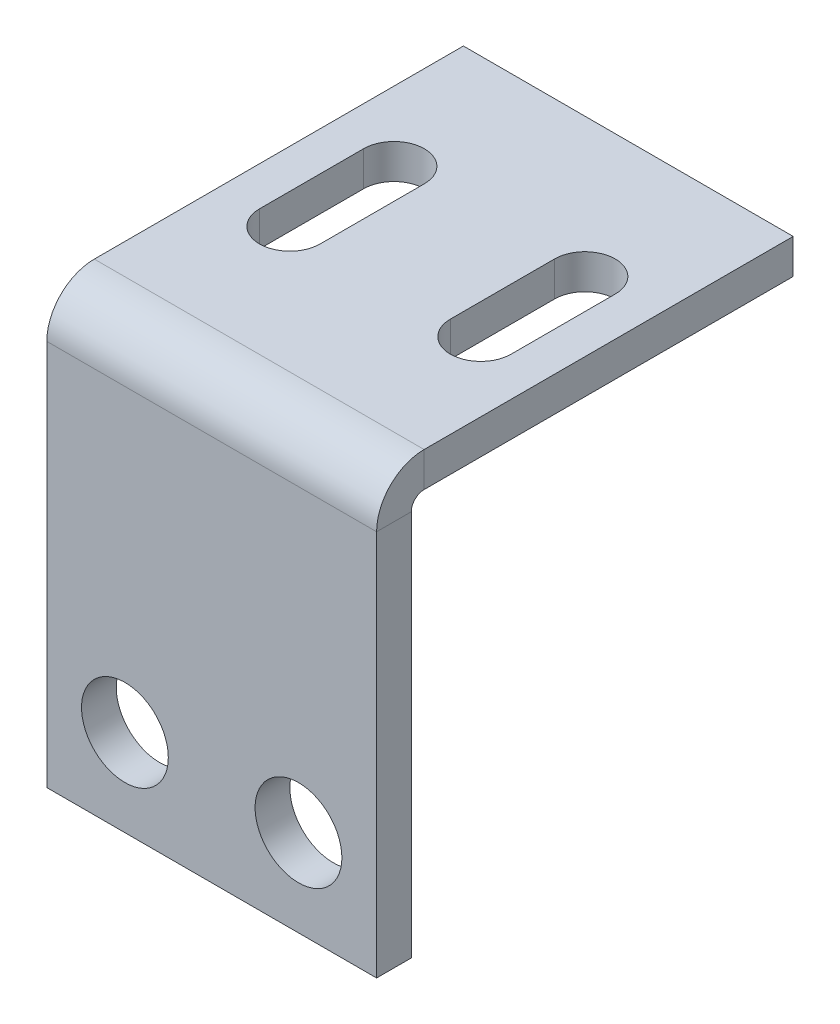
ISO-10303-21;
HEADER;
FILE_DESCRIPTION(('STEP AP214'),'2;1');
FILE_NAME('part.step','',(''),(''),'','','');
FILE_SCHEMA(('AUTOMOTIVE_DESIGN { 1 0 10303 214 1 1 1 1 }'));
ENDSEC;
DATA;
#1=APPLICATION_CONTEXT('core data for automotive mechanical design processes');
#2=APPLICATION_PROTOCOL_DEFINITION('international standard','automotive_design',2000,#1);
#3=PRODUCT_CONTEXT('',#1,'mechanical');
#4=PRODUCT('Part','Part','',(#3));
#5=PRODUCT_RELATED_PRODUCT_CATEGORY('part','',(#4));
#6=PRODUCT_DEFINITION_FORMATION('','',#4);
#7=PRODUCT_DEFINITION_CONTEXT('part definition',#1,'design');
#8=PRODUCT_DEFINITION('design','',#6,#7);
#9=PRODUCT_DEFINITION_SHAPE('','',#8);
#10=(LENGTH_UNIT() NAMED_UNIT(*) SI_UNIT(.MILLI.,.METRE.));
#11=(NAMED_UNIT(*) PLANE_ANGLE_UNIT() SI_UNIT($,.RADIAN.));
#12=(NAMED_UNIT(*) SI_UNIT($,.STERADIAN.) SOLID_ANGLE_UNIT());
#13=UNCERTAINTY_MEASURE_WITH_UNIT(LENGTH_MEASURE(1.E-05),#10,'distance_accuracy_value','');
#14=(GEOMETRIC_REPRESENTATION_CONTEXT(3) GLOBAL_UNCERTAINTY_ASSIGNED_CONTEXT((#13)) GLOBAL_UNIT_ASSIGNED_CONTEXT((#10,
#11,#12)) REPRESENTATION_CONTEXT('',''));
#15=CARTESIAN_POINT('',(0.,0.,0.));
#16=DIRECTION('',(0.,0.,1.));
#17=DIRECTION('',(1.,0.,0.));
#18=AXIS2_PLACEMENT_3D('',#15,#16,#17);
#19=CARTESIAN_POINT('',(9.49999999999998,12.5,-2.));
#20=DIRECTION('',(1.,0.,0.));
#21=DIRECTION('',(0.,1.,0.));
#22=AXIS2_PLACEMENT_3D('',#19,#20,#21);
#23=PLANE('',#22);
#24=DIRECTION('',(0.,1.,0.));
#25=VECTOR('',#24,1.);
#26=CARTESIAN_POINT('',(9.49999999999998,12.5,-2.));
#27=LINE('',#26,#25);
#28=CARTESIAN_POINT('',(9.49999999999998,-12.5,-2.));
#29=VERTEX_POINT('',#28);
#30=CARTESIAN_POINT('',(9.49999999999998,9.76339999999996,-2.));
#31=VERTEX_POINT('',#30);
#32=EDGE_CURVE('E279',#29,#31,#27,.T.);
#33=ORIENTED_EDGE('',*,*,#32,.T.);
#34=DIRECTION('',(0.,0.,1.));
#35=VECTOR('',#34,1.);
#36=CARTESIAN_POINT('',(9.49999999999998,9.76339999999996,-2.));
#37=LINE('',#36,#35);
#38=CARTESIAN_POINT('',(9.49999999999998,9.76339999999996,0.));
#39=VERTEX_POINT('',#38);
#40=EDGE_CURVE('E251',#31,#39,#37,.T.);
#41=ORIENTED_EDGE('',*,*,#40,.T.);
#42=DIRECTION('',(0.,1.,0.));
#43=VECTOR('',#42,1.);
#44=CARTESIAN_POINT('',(9.49999999999998,12.5,0.));
#45=LINE('',#44,#43);
#46=CARTESIAN_POINT('',(9.49999999999998,-12.5,0.));
#47=VERTEX_POINT('',#46);
#48=EDGE_CURVE('E276',#47,#39,#45,.T.);
#49=ORIENTED_EDGE('',*,*,#48,.F.);
#50=DIRECTION('',(0.,0.,1.));
#51=VECTOR('',#50,1.);
#52=CARTESIAN_POINT('',(9.49999999999998,-12.5,-2.));
#53=LINE('',#52,#51);
#54=EDGE_CURVE('E295',#29,#47,#53,.T.);
#55=ORIENTED_EDGE('',*,*,#54,.F.);
#56=EDGE_LOOP('',(#33,#41,#49,#55));
#57=FACE_BOUND('',#56,.T.);
#58=ADVANCED_FACE('F54',(#57),#23,.T.);
#59=CARTESIAN_POINT('',(9.49999999999998,-12.5,-2.));
#60=DIRECTION('',(0.,0.,1.));
#61=DIRECTION('',(1.,0.,0.));
#62=AXIS2_PLACEMENT_3D('',#59,#60,#61);
#63=PLANE('',#62);
#64=CARTESIAN_POINT('',(-5.00000000000002,-7.50000000000004,-2.));
#65=DIRECTION('',(0.,0.,1.));
#66=DIRECTION('',(1.,0.,0.));
#67=AXIS2_PLACEMENT_3D('',#64,#65,#66);
#68=CIRCLE('',#67,2.5);
#69=CARTESIAN_POINT('',(-2.50000000000002,-7.50000000000004,-2.));
#70=VERTEX_POINT('',#69);
#71=EDGE_CURVE('E273',#70,#70,#68,.T.);
#72=ORIENTED_EDGE('',*,*,#71,.T.);
#73=EDGE_LOOP('',(#72));
#74=FACE_BOUND('',#73,.T.);
#75=CARTESIAN_POINT('',(4.99999999999998,-7.50000000000004,-2.));
#76=DIRECTION('',(0.,0.,1.));
#77=DIRECTION('',(1.,0.,0.));
#78=AXIS2_PLACEMENT_3D('',#75,#76,#77);
#79=CIRCLE('',#78,2.5);
#80=CARTESIAN_POINT('',(7.49999999999998,-7.50000000000004,-2.));
#81=VERTEX_POINT('',#80);
#82=EDGE_CURVE('E267',#81,#81,#79,.T.);
#83=ORIENTED_EDGE('',*,*,#82,.T.);
#84=EDGE_LOOP('',(#83));
#85=FACE_BOUND('',#84,.T.);
#86=DIRECTION('',(1.,0.,0.));
#87=VECTOR('',#86,1.);
#88=CARTESIAN_POINT('',(9.49999999999998,9.76339999999996,-2.));
#89=LINE('',#88,#87);
#90=CARTESIAN_POINT('',(-9.50000000000002,9.76339999999996,-2.));
#91=VERTEX_POINT('',#90);
#92=EDGE_CURVE('E257',#31,#91,#89,.F.);
#93=ORIENTED_EDGE('',*,*,#92,.F.);
#94=ORIENTED_EDGE('',*,*,#32,.F.);
#95=DIRECTION('',(1.,0.,0.));
#96=VECTOR('',#95,1.);
#97=CARTESIAN_POINT('',(-9.50000000000002,-12.5,-2.));
#98=LINE('',#97,#96);
#99=CARTESIAN_POINT('',(-9.50000000000002,-12.5,-2.));
#100=VERTEX_POINT('',#99);
#101=EDGE_CURVE('E285',#100,#29,#98,.T.);
#102=ORIENTED_EDGE('',*,*,#101,.F.);
#103=DIRECTION('',(0.,-1.,0.));
#104=VECTOR('',#103,1.);
#105=CARTESIAN_POINT('',(-9.50000000000002,12.5,-2.));
#106=LINE('',#105,#104);
#107=EDGE_CURVE('E282',#91,#100,#106,.T.);
#108=ORIENTED_EDGE('',*,*,#107,.F.);
#109=EDGE_LOOP('',(#93,#94,#102,#108));
#110=FACE_BOUND('',#109,.T.);
#111=ADVANCED_FACE('F333',(#74,#85,#110),#63,.F.);
#112=CARTESIAN_POINT('',(9.49999999999998,-12.5,0.));
#113=DIRECTION('',(0.,0.,1.));
#114=DIRECTION('',(1.,0.,0.));
#115=AXIS2_PLACEMENT_3D('',#112,#113,#114);
#116=PLANE('',#115);
#117=CARTESIAN_POINT('',(-5.00000000000002,-7.50000000000004,0.));
#118=DIRECTION('',(0.,0.,1.));
#119=DIRECTION('',(1.,0.,0.));
#120=AXIS2_PLACEMENT_3D('',#117,#118,#119);
#121=CIRCLE('',#120,2.5);
#122=CARTESIAN_POINT('',(-2.50000000000002,-7.50000000000004,0.));
#123=VERTEX_POINT('',#122);
#124=EDGE_CURVE('E270',#123,#123,#121,.T.);
#125=ORIENTED_EDGE('',*,*,#124,.F.);
#126=EDGE_LOOP('',(#125));
#127=FACE_BOUND('',#126,.T.);
#128=CARTESIAN_POINT('',(4.99999999999998,-7.50000000000004,0.));
#129=DIRECTION('',(0.,0.,1.));
#130=DIRECTION('',(1.,0.,0.));
#131=AXIS2_PLACEMENT_3D('',#128,#129,#130);
#132=CIRCLE('',#131,2.5);
#133=CARTESIAN_POINT('',(7.49999999999998,-7.50000000000004,0.));
#134=VERTEX_POINT('',#133);
#135=EDGE_CURVE('E264',#134,#134,#132,.T.);
#136=ORIENTED_EDGE('',*,*,#135,.F.);
#137=EDGE_LOOP('',(#136));
#138=FACE_BOUND('',#137,.T.);
#139=ORIENTED_EDGE('',*,*,#48,.T.);
#140=DIRECTION('',(1.,0.,0.));
#141=VECTOR('',#140,1.);
#142=CARTESIAN_POINT('',(9.49999999999998,9.76339999999996,0.));
#143=LINE('',#142,#141);
#144=CARTESIAN_POINT('',(-9.50000000000002,9.76339999999996,0.));
#145=VERTEX_POINT('',#144);
#146=EDGE_CURVE('E244',#39,#145,#143,.F.);
#147=ORIENTED_EDGE('',*,*,#146,.T.);
#148=DIRECTION('',(0.,-1.,0.));
#149=VECTOR('',#148,1.);
#150=CARTESIAN_POINT('',(-9.50000000000002,12.5,0.));
#151=LINE('',#150,#149);
#152=CARTESIAN_POINT('',(-9.50000000000002,-12.5,0.));
#153=VERTEX_POINT('',#152);
#154=EDGE_CURVE('E291',#145,#153,#151,.T.);
#155=ORIENTED_EDGE('',*,*,#154,.T.);
#156=DIRECTION('',(1.,0.,0.));
#157=VECTOR('',#156,1.);
#158=CARTESIAN_POINT('',(-9.50000000000002,-12.5,0.));
#159=LINE('',#158,#157);
#160=EDGE_CURVE('E283',#153,#47,#159,.T.);
#161=ORIENTED_EDGE('',*,*,#160,.T.);
#162=EDGE_LOOP('',(#139,#147,#155,#161));
#163=FACE_BOUND('',#162,.T.);
#164=ADVANCED_FACE('F338',(#127,#138,#163),#116,.T.);
#165=CARTESIAN_POINT('',(-9.50000000000002,-12.5,-2.));
#166=DIRECTION('',(0.,-1.,0.));
#167=DIRECTION('',(0.,0.,-1.));
#168=AXIS2_PLACEMENT_3D('',#165,#166,#167);
#169=PLANE('',#168);
#170=ORIENTED_EDGE('',*,*,#160,.F.);
#171=DIRECTION('',(0.,0.,1.));
#172=VECTOR('',#171,1.);
#173=CARTESIAN_POINT('',(-9.50000000000002,-12.5,-2.));
#174=LINE('',#173,#172);
#175=EDGE_CURVE('E288',#100,#153,#174,.T.);
#176=ORIENTED_EDGE('',*,*,#175,.F.);
#177=ORIENTED_EDGE('',*,*,#101,.T.);
#178=ORIENTED_EDGE('',*,*,#54,.T.);
#179=EDGE_LOOP('',(#170,#176,#177,#178));
#180=FACE_BOUND('',#179,.T.);
#181=ADVANCED_FACE('F350',(#180),#169,.T.);
#182=CARTESIAN_POINT('',(-9.50000000000002,12.5,-2.));
#183=DIRECTION('',(-1.,0.,0.));
#184=DIRECTION('',(0.,-1.,0.));
#185=AXIS2_PLACEMENT_3D('',#182,#183,#184);
#186=PLANE('',#185);
#187=DIRECTION('',(0.,0.,1.));
#188=VECTOR('',#187,1.);
#189=CARTESIAN_POINT('',(-9.50000000000002,9.76339999999996,-2.));
#190=LINE('',#189,#188);
#191=EDGE_CURVE('E261',#91,#145,#190,.T.);
#192=ORIENTED_EDGE('',*,*,#191,.F.);
#193=ORIENTED_EDGE('',*,*,#107,.T.);
#194=ORIENTED_EDGE('',*,*,#175,.T.);
#195=ORIENTED_EDGE('',*,*,#154,.F.);
#196=EDGE_LOOP('',(#192,#193,#194,#195));
#197=FACE_BOUND('',#196,.T.);
#198=ADVANCED_FACE('F354',(#197),#186,.T.);
#199=CARTESIAN_POINT('',(-5.00000000000002,-7.50000000000004,-2.));
#200=DIRECTION('',(0.,0.,1.));
#201=DIRECTION('',(1.,0.,0.));
#202=AXIS2_PLACEMENT_3D('',#199,#200,#201);
#203=CYLINDRICAL_SURFACE('',#202,2.5);
#204=ORIENTED_EDGE('',*,*,#71,.F.);
#205=EDGE_LOOP('',(#204));
#206=FACE_BOUND('',#205,.T.);
#207=ORIENTED_EDGE('',*,*,#124,.T.);
#208=EDGE_LOOP('',(#207));
#209=FACE_BOUND('',#208,.T.);
#210=ADVANCED_FACE('F411',(#206,#209),#203,.F.);
#211=CARTESIAN_POINT('',(4.99999999999998,-7.50000000000004,-2.));
#212=DIRECTION('',(0.,0.,1.));
#213=DIRECTION('',(1.,0.,0.));
#214=AXIS2_PLACEMENT_3D('',#211,#212,#213);
#215=CYLINDRICAL_SURFACE('',#214,2.5);
#216=ORIENTED_EDGE('',*,*,#82,.F.);
#217=EDGE_LOOP('',(#216));
#218=FACE_BOUND('',#217,.T.);
#219=ORIENTED_EDGE('',*,*,#135,.T.);
#220=EDGE_LOOP('',(#219));
#221=FACE_BOUND('',#220,.T.);
#222=ADVANCED_FACE('F406',(#218,#221),#215,.F.);
#223=CARTESIAN_POINT('',(-9.50000000000002,9.76339999999996,-2.7366));
#224=DIRECTION('',(-1.,0.,0.));
#225=DIRECTION('',(0.,0.,1.));
#226=AXIS2_PLACEMENT_3D('',#223,#224,#225);
#227=PLANE('',#226);
#228=DIRECTION('',(0.,-1.,0.));
#229=VECTOR('',#228,1.);
#230=CARTESIAN_POINT('',(-9.50000000000002,12.5,-2.73659999999999));
#231=LINE('',#230,#229);
#232=CARTESIAN_POINT('',(-9.50000000000002,10.5,-2.7366));
#233=VERTEX_POINT('',#232);
#234=CARTESIAN_POINT('',(-9.50000000000002,12.5,-2.73659999999999));
#235=VERTEX_POINT('',#234);
#236=EDGE_CURVE('E207',#233,#235,#231,.F.);
#237=ORIENTED_EDGE('',*,*,#236,.F.);
#238=CARTESIAN_POINT('',(-9.50000000000002,9.76339999999996,-2.7366));
#239=DIRECTION('',(1.,0.,0.));
#240=DIRECTION('',(0.,0.,-1.));
#241=AXIS2_PLACEMENT_3D('',#238,#239,#240);
#242=CIRCLE('',#241,0.7366);
#243=EDGE_CURVE('E254',#91,#233,#242,.F.);
#244=ORIENTED_EDGE('',*,*,#243,.F.);
#245=ORIENTED_EDGE('',*,*,#191,.T.);
#246=CARTESIAN_POINT('',(-9.50000000000002,9.76339999999996,-2.7366));
#247=DIRECTION('',(1.,0.,0.));
#248=DIRECTION('',(0.,0.,-1.));
#249=AXIS2_PLACEMENT_3D('',#246,#247,#248);
#250=CIRCLE('',#249,2.7366);
#251=EDGE_CURVE('E247',#145,#235,#250,.F.);
#252=ORIENTED_EDGE('',*,*,#251,.T.);
#253=EDGE_LOOP('',(#237,#244,#245,#252));
#254=FACE_BOUND('',#253,.T.);
#255=ADVANCED_FACE('F357',(#254),#227,.T.);
#256=CARTESIAN_POINT('',(9.49999999999998,9.76339999999996,-2.7366));
#257=DIRECTION('',(-1.,0.,0.));
#258=DIRECTION('',(0.,0.,1.));
#259=AXIS2_PLACEMENT_3D('',#256,#257,#258);
#260=PLANE('',#259);
#261=CARTESIAN_POINT('',(9.49999999999998,9.76339999999996,-2.7366));
#262=DIRECTION('',(1.,0.,0.));
#263=DIRECTION('',(0.,0.,-1.));
#264=AXIS2_PLACEMENT_3D('',#261,#262,#263);
#265=CIRCLE('',#264,0.7366);
#266=CARTESIAN_POINT('',(9.49999999999998,10.5,-2.7366));
#267=VERTEX_POINT('',#266);
#268=EDGE_CURVE('E217',#267,#31,#265,.T.);
#269=ORIENTED_EDGE('',*,*,#268,.F.);
#270=DIRECTION('',(0.,-1.,0.));
#271=VECTOR('',#270,1.);
#272=CARTESIAN_POINT('',(9.49999999999998,10.5,-2.7366));
#273=LINE('',#272,#271);
#274=CARTESIAN_POINT('',(9.49999999999998,12.5,-2.73659999999999));
#275=VERTEX_POINT('',#274);
#276=EDGE_CURVE('E237',#267,#275,#273,.F.);
#277=ORIENTED_EDGE('',*,*,#276,.T.);
#278=CARTESIAN_POINT('',(9.49999999999998,9.76339999999996,-2.7366));
#279=DIRECTION('',(1.,0.,0.));
#280=DIRECTION('',(0.,0.,-1.));
#281=AXIS2_PLACEMENT_3D('',#278,#279,#280);
#282=CIRCLE('',#281,2.7366);
#283=EDGE_CURVE('E248',#275,#39,#282,.T.);
#284=ORIENTED_EDGE('',*,*,#283,.T.);
#285=ORIENTED_EDGE('',*,*,#40,.F.);
#286=EDGE_LOOP('',(#269,#277,#284,#285));
#287=FACE_BOUND('',#286,.T.);
#288=ADVANCED_FACE('F363',(#287),#260,.F.);
#289=CARTESIAN_POINT('',(9.49999999999998,9.76339999999996,-2.7366));
#290=DIRECTION('',(1.,0.,0.));
#291=DIRECTION('',(0.,1.,0.));
#292=AXIS2_PLACEMENT_3D('',#289,#290,#291);
#293=CYLINDRICAL_SURFACE('',#292,2.7366);
#294=ORIENTED_EDGE('',*,*,#146,.F.);
#295=ORIENTED_EDGE('',*,*,#283,.F.);
#296=DIRECTION('',(1.,0.,0.));
#297=VECTOR('',#296,1.);
#298=CARTESIAN_POINT('',(-9.50000000000002,12.5,-2.73659999999999));
#299=LINE('',#298,#297);
#300=EDGE_CURVE('E235',#275,#235,#299,.F.);
#301=ORIENTED_EDGE('',*,*,#300,.T.);
#302=ORIENTED_EDGE('',*,*,#251,.F.);
#303=EDGE_LOOP('',(#294,#295,#301,#302));
#304=FACE_BOUND('',#303,.T.);
#305=ADVANCED_FACE('F360',(#304),#293,.T.);
#306=CARTESIAN_POINT('',(9.49999999999998,9.76339999999996,-2.7366));
#307=DIRECTION('',(1.,0.,0.));
#308=DIRECTION('',(0.,1.,0.));
#309=AXIS2_PLACEMENT_3D('',#306,#307,#308);
#310=CYLINDRICAL_SURFACE('',#309,0.7366);
#311=ORIENTED_EDGE('',*,*,#92,.T.);
#312=ORIENTED_EDGE('',*,*,#243,.T.);
#313=DIRECTION('',(1.,0.,0.));
#314=VECTOR('',#313,1.);
#315=CARTESIAN_POINT('',(-9.50000000000002,10.5,-2.7366));
#316=LINE('',#315,#314);
#317=EDGE_CURVE('E240',#233,#267,#316,.T.);
#318=ORIENTED_EDGE('',*,*,#317,.T.);
#319=ORIENTED_EDGE('',*,*,#268,.T.);
#320=EDGE_LOOP('',(#311,#312,#318,#319));
#321=FACE_BOUND('',#320,.T.);
#322=ADVANCED_FACE('F383',(#321),#310,.F.);
#323=CARTESIAN_POINT('',(9.49999999999998,12.5,-24.));
#324=DIRECTION('',(-1.,0.,0.));
#325=DIRECTION('',(0.,0.,1.));
#326=AXIS2_PLACEMENT_3D('',#323,#324,#325);
#327=PLANE('',#326);
#328=ORIENTED_EDGE('',*,*,#276,.F.);
#329=DIRECTION('',(0.,0.,1.));
#330=VECTOR('',#329,1.);
#331=CARTESIAN_POINT('',(9.49999999999998,10.5,-24.));
#332=LINE('',#331,#330);
#333=CARTESIAN_POINT('',(9.49999999999998,10.5,-24.));
#334=VERTEX_POINT('',#333);
#335=EDGE_CURVE('E233',#267,#334,#332,.F.);
#336=ORIENTED_EDGE('',*,*,#335,.T.);
#337=DIRECTION('',(0.,-1.,0.));
#338=VECTOR('',#337,1.);
#339=CARTESIAN_POINT('',(9.49999999999998,12.5,-24.));
#340=LINE('',#339,#338);
#341=CARTESIAN_POINT('',(9.49999999999998,12.5,-24.));
#342=VERTEX_POINT('',#341);
#343=EDGE_CURVE('E214',#342,#334,#340,.T.);
#344=ORIENTED_EDGE('',*,*,#343,.F.);
#345=DIRECTION('',(0.,0.,-1.));
#346=VECTOR('',#345,1.);
#347=CARTESIAN_POINT('',(9.49999999999998,12.5,-1.99999999999999));
#348=LINE('',#347,#346);
#349=EDGE_CURVE('E226',#275,#342,#348,.T.);
#350=ORIENTED_EDGE('',*,*,#349,.F.);
#351=EDGE_LOOP('',(#328,#336,#344,#350));
#352=FACE_BOUND('',#351,.T.);
#353=ADVANCED_FACE('F372',(#352),#327,.F.);
#354=CARTESIAN_POINT('',(-9.50000000000002,12.5,-1.99999999999999));
#355=DIRECTION('',(1.,0.,0.));
#356=DIRECTION('',(0.,0.,-1.));
#357=AXIS2_PLACEMENT_3D('',#354,#355,#356);
#358=PLANE('',#357);
#359=ORIENTED_EDGE('',*,*,#236,.T.);
#360=DIRECTION('',(0.,0.,1.));
#361=VECTOR('',#360,1.);
#362=CARTESIAN_POINT('',(-9.50000000000002,12.5,-1.99999999999999));
#363=LINE('',#362,#361);
#364=CARTESIAN_POINT('',(-9.50000000000002,12.5,-24.));
#365=VERTEX_POINT('',#364);
#366=EDGE_CURVE('E221',#365,#235,#363,.T.);
#367=ORIENTED_EDGE('',*,*,#366,.F.);
#368=DIRECTION('',(0.,-1.,0.));
#369=VECTOR('',#368,1.);
#370=CARTESIAN_POINT('',(-9.50000000000002,12.5,-24.));
#371=LINE('',#370,#369);
#372=CARTESIAN_POINT('',(-9.50000000000002,10.5,-24.));
#373=VERTEX_POINT('',#372);
#374=EDGE_CURVE('E218',#365,#373,#371,.T.);
#375=ORIENTED_EDGE('',*,*,#374,.T.);
#376=DIRECTION('',(0.,0.,-1.));
#377=VECTOR('',#376,1.);
#378=CARTESIAN_POINT('',(-9.50000000000002,10.5,-2.));
#379=LINE('',#378,#377);
#380=EDGE_CURVE('E228',#373,#233,#379,.F.);
#381=ORIENTED_EDGE('',*,*,#380,.T.);
#382=EDGE_LOOP('',(#359,#367,#375,#381));
#383=FACE_BOUND('',#382,.T.);
#384=ADVANCED_FACE('F380',(#383),#358,.F.);
#385=CARTESIAN_POINT('',(-9.50000000000002,12.5,-1.99999999999999));
#386=DIRECTION('',(0.,-1.,0.));
#387=DIRECTION('',(0.,0.,-1.));
#388=AXIS2_PLACEMENT_3D('',#385,#386,#387);
#389=PLANE('',#388);
#390=DIRECTION('',(0.,0.,-1.));
#391=VECTOR('',#390,1.);
#392=CARTESIAN_POINT('',(7.24999999999998,12.5,-9.99999999999999));
#393=LINE('',#392,#391);
#394=CARTESIAN_POINT('',(7.24999999999998,12.5,-9.99999999999999));
#395=VERTEX_POINT('',#394);
#396=CARTESIAN_POINT('',(7.24999999999998,12.5,-16.));
#397=VERTEX_POINT('',#396);
#398=EDGE_CURVE('E177',#395,#397,#393,.T.);
#399=ORIENTED_EDGE('',*,*,#398,.F.);
#400=CARTESIAN_POINT('',(5.49999999999998,12.5,-9.99999999999999));
#401=DIRECTION('',(0.,1.,0.));
#402=DIRECTION('',(0.,0.,1.));
#403=AXIS2_PLACEMENT_3D('',#400,#401,#402);
#404=CIRCLE('',#403,1.75);
#405=CARTESIAN_POINT('',(3.74999999999998,12.5,-9.99999999999999));
#406=VERTEX_POINT('',#405);
#407=EDGE_CURVE('E68',#406,#395,#404,.T.);
#408=ORIENTED_EDGE('',*,*,#407,.F.);
#409=DIRECTION('',(0.,0.,1.));
#410=VECTOR('',#409,1.);
#411=CARTESIAN_POINT('',(3.74999999999998,12.5,-9.99999999999999));
#412=LINE('',#411,#410);
#413=CARTESIAN_POINT('',(3.74999999999998,12.5,-16.));
#414=VERTEX_POINT('',#413);
#415=EDGE_CURVE('E184',#414,#406,#412,.T.);
#416=ORIENTED_EDGE('',*,*,#415,.F.);
#417=CARTESIAN_POINT('',(5.49999999999998,12.5,-16.));
#418=DIRECTION('',(0.,1.,0.));
#419=DIRECTION('',(0.,0.,1.));
#420=AXIS2_PLACEMENT_3D('',#417,#418,#419);
#421=CIRCLE('',#420,1.75);
#422=EDGE_CURVE('E168',#397,#414,#421,.T.);
#423=ORIENTED_EDGE('',*,*,#422,.F.);
#424=EDGE_LOOP('',(#399,#408,#416,#423));
#425=FACE_BOUND('',#424,.T.);
#426=DIRECTION('',(0.,0.,-1.));
#427=VECTOR('',#426,1.);
#428=CARTESIAN_POINT('',(-3.75000000000002,12.5,-9.99999999999999));
#429=LINE('',#428,#427);
#430=CARTESIAN_POINT('',(-3.75000000000002,12.5,-9.99999999999999));
#431=VERTEX_POINT('',#430);
#432=CARTESIAN_POINT('',(-3.75000000000002,12.5,-16.));
#433=VERTEX_POINT('',#432);
#434=EDGE_CURVE('E195',#431,#433,#429,.T.);
#435=ORIENTED_EDGE('',*,*,#434,.F.);
#436=CARTESIAN_POINT('',(-5.50000000000002,12.5,-9.99999999999999));
#437=DIRECTION('',(0.,1.,0.));
#438=DIRECTION('',(0.,0.,1.));
#439=AXIS2_PLACEMENT_3D('',#436,#437,#438);
#440=CIRCLE('',#439,1.75);
#441=CARTESIAN_POINT('',(-7.25000000000002,12.5,-9.99999999999999));
#442=VERTEX_POINT('',#441);
#443=EDGE_CURVE('E191',#442,#431,#440,.T.);
#444=ORIENTED_EDGE('',*,*,#443,.F.);
#445=DIRECTION('',(0.,0.,1.));
#446=VECTOR('',#445,1.);
#447=CARTESIAN_POINT('',(-7.25000000000002,12.5,-9.99999999999999));
#448=LINE('',#447,#446);
#449=CARTESIAN_POINT('',(-7.25000000000002,12.5,-16.));
#450=VERTEX_POINT('',#449);
#451=EDGE_CURVE('E201',#450,#442,#448,.T.);
#452=ORIENTED_EDGE('',*,*,#451,.F.);
#453=CARTESIAN_POINT('',(-5.50000000000002,12.5,-16.));
#454=DIRECTION('',(0.,1.,0.));
#455=DIRECTION('',(0.,0.,1.));
#456=AXIS2_PLACEMENT_3D('',#453,#454,#455);
#457=CIRCLE('',#456,1.75);
#458=EDGE_CURVE('E198',#433,#450,#457,.T.);
#459=ORIENTED_EDGE('',*,*,#458,.F.);
#460=EDGE_LOOP('',(#435,#444,#452,#459));
#461=FACE_BOUND('',#460,.T.);
#462=ORIENTED_EDGE('',*,*,#300,.F.);
#463=ORIENTED_EDGE('',*,*,#349,.T.);
#464=DIRECTION('',(-1.,0.,0.));
#465=VECTOR('',#464,1.);
#466=CARTESIAN_POINT('',(-9.50000000000002,12.5,-24.));
#467=LINE('',#466,#465);
#468=EDGE_CURVE('E224',#342,#365,#467,.T.);
#469=ORIENTED_EDGE('',*,*,#468,.T.);
#470=ORIENTED_EDGE('',*,*,#366,.T.);
#471=EDGE_LOOP('',(#462,#463,#469,#470));
#472=FACE_BOUND('',#471,.T.);
#473=ADVANCED_FACE('F181',(#425,#461,#472),#389,.F.);
#474=CARTESIAN_POINT('',(-9.50000000000002,10.5,-2.));
#475=DIRECTION('',(0.,-1.,0.));
#476=DIRECTION('',(0.,0.,-1.));
#477=AXIS2_PLACEMENT_3D('',#474,#475,#476);
#478=PLANE('',#477);
#479=CARTESIAN_POINT('',(5.49999999999998,10.5,-10.));
#480=DIRECTION('',(0.,-1.,0.));
#481=DIRECTION('',(0.,0.,-1.));
#482=AXIS2_PLACEMENT_3D('',#479,#480,#481);
#483=CIRCLE('',#482,1.75);
#484=CARTESIAN_POINT('',(7.24999999999998,10.5,-10.));
#485=VERTEX_POINT('',#484);
#486=CARTESIAN_POINT('',(3.74999999999998,10.5,-10.));
#487=VERTEX_POINT('',#486);
#488=EDGE_CURVE('E13',#485,#487,#483,.T.);
#489=ORIENTED_EDGE('',*,*,#488,.F.);
#490=DIRECTION('',(0.,0.,1.));
#491=VECTOR('',#490,1.);
#492=CARTESIAN_POINT('',(7.24999999999998,10.5,-2.));
#493=LINE('',#492,#491);
#494=CARTESIAN_POINT('',(7.24999999999998,10.5,-16.));
#495=VERTEX_POINT('',#494);
#496=EDGE_CURVE('E308',#495,#485,#493,.T.);
#497=ORIENTED_EDGE('',*,*,#496,.F.);
#498=CARTESIAN_POINT('',(5.49999999999998,10.5,-16.));
#499=DIRECTION('',(0.,-1.,0.));
#500=DIRECTION('',(0.,0.,-1.));
#501=AXIS2_PLACEMENT_3D('',#498,#499,#500);
#502=CIRCLE('',#501,1.75);
#503=CARTESIAN_POINT('',(3.74999999999998,10.5,-16.));
#504=VERTEX_POINT('',#503);
#505=EDGE_CURVE('E171',#504,#495,#502,.T.);
#506=ORIENTED_EDGE('',*,*,#505,.F.);
#507=DIRECTION('',(0.,0.,-1.));
#508=VECTOR('',#507,1.);
#509=CARTESIAN_POINT('',(3.74999999999998,10.5,-2.));
#510=LINE('',#509,#508);
#511=EDGE_CURVE('E61',#487,#504,#510,.T.);
#512=ORIENTED_EDGE('',*,*,#511,.F.);
#513=EDGE_LOOP('',(#489,#497,#506,#512));
#514=FACE_BOUND('',#513,.T.);
#515=CARTESIAN_POINT('',(-5.50000000000002,10.5,-10.));
#516=DIRECTION('',(0.,-1.,0.));
#517=DIRECTION('',(0.,0.,-1.));
#518=AXIS2_PLACEMENT_3D('',#515,#516,#517);
#519=CIRCLE('',#518,1.75);
#520=CARTESIAN_POINT('',(-3.75000000000002,10.5,-10.));
#521=VERTEX_POINT('',#520);
#522=CARTESIAN_POINT('',(-7.25000000000002,10.5,-10.));
#523=VERTEX_POINT('',#522);
#524=EDGE_CURVE('E306',#521,#523,#519,.T.);
#525=ORIENTED_EDGE('',*,*,#524,.F.);
#526=DIRECTION('',(0.,0.,1.));
#527=VECTOR('',#526,1.);
#528=CARTESIAN_POINT('',(-3.75000000000002,10.5,-2.));
#529=LINE('',#528,#527);
#530=CARTESIAN_POINT('',(-3.75000000000002,10.5,-16.));
#531=VERTEX_POINT('',#530);
#532=EDGE_CURVE('E297',#531,#521,#529,.T.);
#533=ORIENTED_EDGE('',*,*,#532,.F.);
#534=CARTESIAN_POINT('',(-5.50000000000002,10.5,-16.));
#535=DIRECTION('',(0.,-1.,0.));
#536=DIRECTION('',(0.,0.,-1.));
#537=AXIS2_PLACEMENT_3D('',#534,#535,#536);
#538=CIRCLE('',#537,1.75);
#539=CARTESIAN_POINT('',(-7.25000000000002,10.5,-16.));
#540=VERTEX_POINT('',#539);
#541=EDGE_CURVE('E301',#540,#531,#538,.T.);
#542=ORIENTED_EDGE('',*,*,#541,.F.);
#543=DIRECTION('',(0.,0.,-1.));
#544=VECTOR('',#543,1.);
#545=CARTESIAN_POINT('',(-7.25000000000002,10.5,-2.));
#546=LINE('',#545,#544);
#547=EDGE_CURVE('E304',#523,#540,#546,.T.);
#548=ORIENTED_EDGE('',*,*,#547,.F.);
#549=EDGE_LOOP('',(#525,#533,#542,#548));
#550=FACE_BOUND('',#549,.T.);
#551=ORIENTED_EDGE('',*,*,#335,.F.);
#552=ORIENTED_EDGE('',*,*,#317,.F.);
#553=ORIENTED_EDGE('',*,*,#380,.F.);
#554=DIRECTION('',(1.,0.,0.));
#555=VECTOR('',#554,1.);
#556=CARTESIAN_POINT('',(-9.50000000000002,10.5,-24.));
#557=LINE('',#556,#555);
#558=EDGE_CURVE('E231',#334,#373,#557,.F.);
#559=ORIENTED_EDGE('',*,*,#558,.F.);
#560=EDGE_LOOP('',(#551,#552,#553,#559));
#561=FACE_BOUND('',#560,.T.);
#562=ADVANCED_FACE('F316',(#514,#550,#561),#478,.T.);
#563=CARTESIAN_POINT('',(-9.50000000000002,12.5,-24.));
#564=DIRECTION('',(0.,0.,1.));
#565=DIRECTION('',(0.,-1.,0.));
#566=AXIS2_PLACEMENT_3D('',#563,#564,#565);
#567=PLANE('',#566);
#568=ORIENTED_EDGE('',*,*,#558,.T.);
#569=ORIENTED_EDGE('',*,*,#374,.F.);
#570=ORIENTED_EDGE('',*,*,#468,.F.);
#571=ORIENTED_EDGE('',*,*,#343,.T.);
#572=EDGE_LOOP('',(#568,#569,#570,#571));
#573=FACE_BOUND('',#572,.T.);
#574=ADVANCED_FACE('F377',(#573),#567,.F.);
#575=CARTESIAN_POINT('',(-5.50000000000002,2.49999999999998,-10.));
#576=DIRECTION('',(0.,1.,0.));
#577=DIRECTION('',(0.,0.,1.));
#578=AXIS2_PLACEMENT_3D('',#575,#576,#577);
#579=CYLINDRICAL_SURFACE('',#578,1.75);
#580=ORIENTED_EDGE('',*,*,#524,.T.);
#581=DIRECTION('',(0.,1.,0.));
#582=VECTOR('',#581,1.);
#583=CARTESIAN_POINT('',(-7.25000000000002,2.49999999999998,-10.));
#584=LINE('',#583,#582);
#585=EDGE_CURVE('E205',#523,#442,#584,.T.);
#586=ORIENTED_EDGE('',*,*,#585,.T.);
#587=ORIENTED_EDGE('',*,*,#443,.T.);
#588=DIRECTION('',(0.,1.,0.));
#589=VECTOR('',#588,1.);
#590=CARTESIAN_POINT('',(-3.75000000000002,2.49999999999998,-10.));
#591=LINE('',#590,#589);
#592=EDGE_CURVE('E204',#521,#431,#591,.T.);
#593=ORIENTED_EDGE('',*,*,#592,.F.);
#594=EDGE_LOOP('',(#580,#586,#587,#593));
#595=FACE_BOUND('',#594,.T.);
#596=ADVANCED_FACE('F391',(#595),#579,.F.);
#597=CARTESIAN_POINT('',(-7.25000000000002,2.49999999999998,-10.));
#598=DIRECTION('',(-1.,0.,0.));
#599=DIRECTION('',(0.,0.,1.));
#600=AXIS2_PLACEMENT_3D('',#597,#598,#599);
#601=PLANE('',#600);
#602=ORIENTED_EDGE('',*,*,#547,.T.);
#603=DIRECTION('',(0.,1.,0.));
#604=VECTOR('',#603,1.);
#605=CARTESIAN_POINT('',(-7.25000000000002,2.5,-16.));
#606=LINE('',#605,#604);
#607=EDGE_CURVE('E208',#540,#450,#606,.T.);
#608=ORIENTED_EDGE('',*,*,#607,.T.);
#609=ORIENTED_EDGE('',*,*,#451,.T.);
#610=ORIENTED_EDGE('',*,*,#585,.F.);
#611=EDGE_LOOP('',(#602,#608,#609,#610));
#612=FACE_BOUND('',#611,.T.);
#613=ADVANCED_FACE('F480',(#612),#601,.F.);
#614=CARTESIAN_POINT('',(-5.50000000000002,2.5,-16.));
#615=DIRECTION('',(0.,1.,0.));
#616=DIRECTION('',(0.,0.,1.));
#617=AXIS2_PLACEMENT_3D('',#614,#615,#616);
#618=CYLINDRICAL_SURFACE('',#617,1.75);
#619=ORIENTED_EDGE('',*,*,#541,.T.);
#620=DIRECTION('',(0.,1.,0.));
#621=VECTOR('',#620,1.);
#622=CARTESIAN_POINT('',(-3.75000000000002,2.5,-16.));
#623=LINE('',#622,#621);
#624=EDGE_CURVE('E210',#531,#433,#623,.T.);
#625=ORIENTED_EDGE('',*,*,#624,.T.);
#626=ORIENTED_EDGE('',*,*,#458,.T.);
#627=ORIENTED_EDGE('',*,*,#607,.F.);
#628=EDGE_LOOP('',(#619,#625,#626,#627));
#629=FACE_BOUND('',#628,.T.);
#630=ADVANCED_FACE('F327',(#629),#618,.F.);
#631=CARTESIAN_POINT('',(-3.75000000000002,2.49999999999998,-10.));
#632=DIRECTION('',(1.,0.,0.));
#633=DIRECTION('',(0.,0.,-1.));
#634=AXIS2_PLACEMENT_3D('',#631,#632,#633);
#635=PLANE('',#634);
#636=ORIENTED_EDGE('',*,*,#532,.T.);
#637=ORIENTED_EDGE('',*,*,#592,.T.);
#638=ORIENTED_EDGE('',*,*,#434,.T.);
#639=ORIENTED_EDGE('',*,*,#624,.F.);
#640=EDGE_LOOP('',(#636,#637,#638,#639));
#641=FACE_BOUND('',#640,.T.);
#642=ADVANCED_FACE('F320',(#641),#635,.F.);
#643=CARTESIAN_POINT('',(5.49999999999998,2.49999999999998,-10.));
#644=DIRECTION('',(0.,1.,0.));
#645=DIRECTION('',(0.,0.,1.));
#646=AXIS2_PLACEMENT_3D('',#643,#644,#645);
#647=CYLINDRICAL_SURFACE('',#646,1.75);
#648=ORIENTED_EDGE('',*,*,#488,.T.);
#649=DIRECTION('',(0.,1.,0.));
#650=VECTOR('',#649,1.);
#651=CARTESIAN_POINT('',(3.74999999999998,2.49999999999998,-10.));
#652=LINE('',#651,#650);
#653=EDGE_CURVE('E189',#487,#406,#652,.T.);
#654=ORIENTED_EDGE('',*,*,#653,.T.);
#655=ORIENTED_EDGE('',*,*,#407,.T.);
#656=DIRECTION('',(0.,1.,0.));
#657=VECTOR('',#656,1.);
#658=CARTESIAN_POINT('',(7.24999999999998,2.49999999999998,-10.));
#659=LINE('',#658,#657);
#660=EDGE_CURVE('E174',#485,#395,#659,.T.);
#661=ORIENTED_EDGE('',*,*,#660,.F.);
#662=EDGE_LOOP('',(#648,#654,#655,#661));
#663=FACE_BOUND('',#662,.T.);
#664=ADVANCED_FACE('F318',(#663),#647,.F.);
#665=CARTESIAN_POINT('',(3.74999999999998,2.49999999999998,-10.));
#666=DIRECTION('',(-1.,0.,0.));
#667=DIRECTION('',(0.,0.,1.));
#668=AXIS2_PLACEMENT_3D('',#665,#666,#667);
#669=PLANE('',#668);
#670=ORIENTED_EDGE('',*,*,#511,.T.);
#671=DIRECTION('',(0.,1.,0.));
#672=VECTOR('',#671,1.);
#673=CARTESIAN_POINT('',(3.74999999999998,2.5,-16.));
#674=LINE('',#673,#672);
#675=EDGE_CURVE('E173',#504,#414,#674,.T.);
#676=ORIENTED_EDGE('',*,*,#675,.T.);
#677=ORIENTED_EDGE('',*,*,#415,.T.);
#678=ORIENTED_EDGE('',*,*,#653,.F.);
#679=EDGE_LOOP('',(#670,#676,#677,#678));
#680=FACE_BOUND('',#679,.T.);
#681=ADVANCED_FACE('F313',(#680),#669,.F.);
#682=CARTESIAN_POINT('',(5.49999999999998,2.5,-16.));
#683=DIRECTION('',(0.,1.,0.));
#684=DIRECTION('',(0.,0.,1.));
#685=AXIS2_PLACEMENT_3D('',#682,#683,#684);
#686=CYLINDRICAL_SURFACE('',#685,1.75);
#687=ORIENTED_EDGE('',*,*,#505,.T.);
#688=DIRECTION('',(0.,1.,0.));
#689=VECTOR('',#688,1.);
#690=CARTESIAN_POINT('',(7.24999999999998,2.5,-16.));
#691=LINE('',#690,#689);
#692=EDGE_CURVE('E76',#495,#397,#691,.T.);
#693=ORIENTED_EDGE('',*,*,#692,.T.);
#694=ORIENTED_EDGE('',*,*,#422,.T.);
#695=ORIENTED_EDGE('',*,*,#675,.F.);
#696=EDGE_LOOP('',(#687,#693,#694,#695));
#697=FACE_BOUND('',#696,.T.);
#698=ADVANCED_FACE('F165',(#697),#686,.F.);
#699=CARTESIAN_POINT('',(7.24999999999998,2.49999999999998,-10.));
#700=DIRECTION('',(1.,0.,0.));
#701=DIRECTION('',(0.,0.,-1.));
#702=AXIS2_PLACEMENT_3D('',#699,#700,#701);
#703=PLANE('',#702);
#704=ORIENTED_EDGE('',*,*,#496,.T.);
#705=ORIENTED_EDGE('',*,*,#660,.T.);
#706=ORIENTED_EDGE('',*,*,#398,.T.);
#707=ORIENTED_EDGE('',*,*,#692,.F.);
#708=EDGE_LOOP('',(#704,#705,#706,#707));
#709=FACE_BOUND('',#708,.T.);
#710=ADVANCED_FACE('F178',(#709),#703,.F.);
#711=CLOSED_SHELL('',(#58,#111,#164,#181,#198,#210,#222,#255,#288,#305,#322,#353,#384,#473,#562,
#574,#596,#613,#630,#642,#664,#681,#698,#710));
#712=MANIFOLD_SOLID_BREP('B2',#711);
#713=ADVANCED_BREP_SHAPE_REPRESENTATION('',(#18,#712),#14);
#714=SHAPE_DEFINITION_REPRESENTATION(#9,#713);
ENDSEC;
END-ISO-10303-21;
